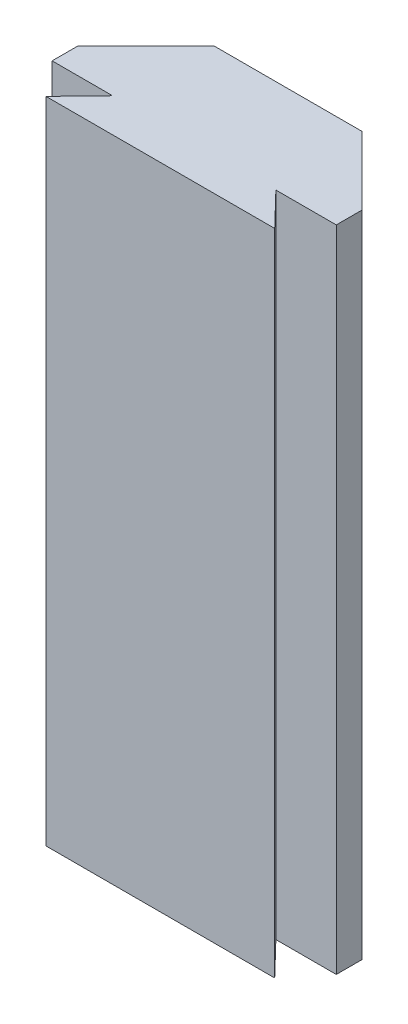
ISO-10303-21;
HEADER;
FILE_DESCRIPTION(('STEP AP214'),'2;1');
FILE_NAME('part.step','',(''),(''),'','','');
FILE_SCHEMA(('AUTOMOTIVE_DESIGN { 1 0 10303 214 1 1 1 1 }'));
ENDSEC;
DATA;
#1=APPLICATION_CONTEXT('core data for automotive mechanical design processes');
#2=APPLICATION_PROTOCOL_DEFINITION('international standard','automotive_design',2000,#1);
#3=PRODUCT_CONTEXT('',#1,'mechanical');
#4=PRODUCT('Part','Part','',(#3));
#5=PRODUCT_RELATED_PRODUCT_CATEGORY('part','',(#4));
#6=PRODUCT_DEFINITION_FORMATION('','',#4);
#7=PRODUCT_DEFINITION_CONTEXT('part definition',#1,'design');
#8=PRODUCT_DEFINITION('design','',#6,#7);
#9=PRODUCT_DEFINITION_SHAPE('','',#8);
#10=(LENGTH_UNIT() NAMED_UNIT(*) SI_UNIT(.MILLI.,.METRE.));
#11=(NAMED_UNIT(*) PLANE_ANGLE_UNIT() SI_UNIT($,.RADIAN.));
#12=(NAMED_UNIT(*) SI_UNIT($,.STERADIAN.) SOLID_ANGLE_UNIT());
#13=UNCERTAINTY_MEASURE_WITH_UNIT(LENGTH_MEASURE(1.E-05),#10,'distance_accuracy_value','');
#14=(GEOMETRIC_REPRESENTATION_CONTEXT(3) GLOBAL_UNCERTAINTY_ASSIGNED_CONTEXT((#13)) GLOBAL_UNIT_ASSIGNED_CONTEXT((#10,
#11,#12)) REPRESENTATION_CONTEXT('',''));
#15=CARTESIAN_POINT('',(0.,0.,0.));
#16=DIRECTION('',(0.,0.,1.));
#17=DIRECTION('',(1.,0.,0.));
#18=AXIS2_PLACEMENT_3D('',#15,#16,#17);
#19=CARTESIAN_POINT('',(-2.62929539890908,25.25,0.366574883446381));
#20=DIRECTION('',(0.707106781186544,0.,0.707106781186551));
#21=DIRECTION('',(0.707106781186551,0.,-0.707106781186544));
#22=AXIS2_PLACEMENT_3D('',#19,#20,#21);
#23=PLANE('',#22);
#24=DIRECTION('',(-0.707106781186551,0.,0.707106781186544));
#25=VECTOR('',#24,1.);
#26=CARTESIAN_POINT('',(-2.62929539890908,0.,0.366574883446381));
#27=LINE('',#26,#25);
#28=CARTESIAN_POINT('',(-2.62929539890908,0.,0.366574883446381));
#29=VERTEX_POINT('',#28);
#30=CARTESIAN_POINT('',(-5.28094582835865,0.,3.01822531289592));
#31=VERTEX_POINT('',#30);
#32=EDGE_CURVE('E141',#29,#31,#27,.T.);
#33=ORIENTED_EDGE('',*,*,#32,.T.);
#34=DIRECTION('',(0.,-1.,0.));
#35=VECTOR('',#34,1.);
#36=CARTESIAN_POINT('',(-5.28094582835865,25.25,3.01822531289592));
#37=LINE('',#36,#35);
#38=CARTESIAN_POINT('',(-5.28094582835865,25.25,3.01822531289592));
#39=VERTEX_POINT('',#38);
#40=EDGE_CURVE('E11',#39,#31,#37,.T.);
#41=ORIENTED_EDGE('',*,*,#40,.F.);
#42=DIRECTION('',(-0.707106781186551,0.,0.707106781186544));
#43=VECTOR('',#42,1.);
#44=CARTESIAN_POINT('',(-2.62929539890908,25.25,0.366574883446381));
#45=LINE('',#44,#43);
#46=CARTESIAN_POINT('',(-2.62929539890908,25.25,0.366574883446381));
#47=VERTEX_POINT('',#46);
#48=EDGE_CURVE('E159',#47,#39,#45,.T.);
#49=ORIENTED_EDGE('',*,*,#48,.F.);
#50=DIRECTION('',(0.,-1.,0.));
#51=VECTOR('',#50,1.);
#52=CARTESIAN_POINT('',(-2.62929539890908,25.25,0.366574883446381));
#53=LINE('',#52,#51);
#54=EDGE_CURVE('E137',#47,#29,#53,.T.);
#55=ORIENTED_EDGE('',*,*,#54,.T.);
#56=EDGE_LOOP('',(#33,#41,#49,#55));
#57=FACE_BOUND('',#56,.T.);
#58=ADVANCED_FACE('F33',(#57),#23,.F.);
#59=CARTESIAN_POINT('',(-5.28094582835865,25.25,3.01822531289592));
#60=DIRECTION('',(1.,0.,0.));
#61=DIRECTION('',(0.,0.,-1.));
#62=AXIS2_PLACEMENT_3D('',#59,#60,#61);
#63=PLANE('',#62);
#64=DIRECTION('',(0.,0.,1.));
#65=VECTOR('',#64,1.);
#66=CARTESIAN_POINT('',(-5.28094582835865,0.,3.01822531289592));
#67=LINE('',#66,#65);
#68=CARTESIAN_POINT('',(-5.28094582835865,0.,4.01822531289592));
#69=VERTEX_POINT('',#68);
#70=EDGE_CURVE('E144',#31,#69,#67,.T.);
#71=ORIENTED_EDGE('',*,*,#70,.T.);
#72=DIRECTION('',(0.,-1.,0.));
#73=VECTOR('',#72,1.);
#74=CARTESIAN_POINT('',(-5.28094582835865,25.25,4.01822531289592));
#75=LINE('',#74,#73);
#76=CARTESIAN_POINT('',(-5.28094582835865,25.25,4.01822531289592));
#77=VERTEX_POINT('',#76);
#78=EDGE_CURVE('E41',#77,#69,#75,.T.);
#79=ORIENTED_EDGE('',*,*,#78,.F.);
#80=DIRECTION('',(0.,0.,1.));
#81=VECTOR('',#80,1.);
#82=CARTESIAN_POINT('',(-5.28094582835865,25.25,3.01822531289592));
#83=LINE('',#82,#81);
#84=EDGE_CURVE('E98',#39,#77,#83,.T.);
#85=ORIENTED_EDGE('',*,*,#84,.F.);
#86=ORIENTED_EDGE('',*,*,#40,.T.);
#87=EDGE_LOOP('',(#71,#79,#85,#86));
#88=FACE_BOUND('',#87,.T.);
#89=ADVANCED_FACE('F208',(#88),#63,.F.);
#90=CARTESIAN_POINT('',(-5.28094582835865,25.25,4.01822531289592));
#91=DIRECTION('',(0.,0.,-1.));
#92=DIRECTION('',(-1.,0.,0.));
#93=AXIS2_PLACEMENT_3D('',#90,#91,#92);
#94=PLANE('',#93);
#95=DIRECTION('',(1.,0.,0.));
#96=VECTOR('',#95,1.);
#97=CARTESIAN_POINT('',(-5.28094582835865,0.,4.01822531289592));
#98=LINE('',#97,#96);
#99=CARTESIAN_POINT('',(-2.93094582835865,0.,4.01822531289592));
#100=VERTEX_POINT('',#99);
#101=EDGE_CURVE('E146',#69,#100,#98,.T.);
#102=ORIENTED_EDGE('',*,*,#101,.T.);
#103=DIRECTION('',(0.,-1.,0.));
#104=VECTOR('',#103,1.);
#105=CARTESIAN_POINT('',(-2.93094582835865,25.25,4.01822531289592));
#106=LINE('',#105,#104);
#107=CARTESIAN_POINT('',(-2.93094582835865,25.25,4.01822531289592));
#108=VERTEX_POINT('',#107);
#109=EDGE_CURVE('E172',#108,#100,#106,.T.);
#110=ORIENTED_EDGE('',*,*,#109,.F.);
#111=DIRECTION('',(1.,0.,0.));
#112=VECTOR('',#111,1.);
#113=CARTESIAN_POINT('',(-5.28094582835865,25.25,4.01822531289592));
#114=LINE('',#113,#112);
#115=EDGE_CURVE('E180',#77,#108,#114,.T.);
#116=ORIENTED_EDGE('',*,*,#115,.F.);
#117=ORIENTED_EDGE('',*,*,#78,.T.);
#118=EDGE_LOOP('',(#102,#110,#116,#117));
#119=FACE_BOUND('',#118,.T.);
#120=ADVANCED_FACE('F178',(#119),#94,.F.);
#121=CARTESIAN_POINT('',(-2.93094582835865,25.25,4.01822531289592));
#122=DIRECTION('',(0.719339800338646,0.,0.694658370459002));
#123=DIRECTION('',(0.694658370459002,0.,-0.719339800338646));
#124=AXIS2_PLACEMENT_3D('',#121,#122,#123);
#125=PLANE('',#124);
#126=DIRECTION('',(-0.694658370459002,0.,0.719339800338646));
#127=VECTOR('',#126,1.);
#128=CARTESIAN_POINT('',(-2.93094582835865,0.,4.01822531289592));
#129=LINE('',#128,#127);
#130=CARTESIAN_POINT('',(-4.20217064629862,0.,5.33461714751564));
#131=VERTEX_POINT('',#130);
#132=EDGE_CURVE('E148',#100,#131,#129,.T.);
#133=ORIENTED_EDGE('',*,*,#132,.T.);
#134=DIRECTION('',(0.,-1.,0.));
#135=VECTOR('',#134,1.);
#136=CARTESIAN_POINT('',(-4.20217064629862,25.25,5.33461714751564));
#137=LINE('',#136,#135);
#138=CARTESIAN_POINT('',(-4.20217064629862,25.25,5.33461714751564));
#139=VERTEX_POINT('',#138);
#140=EDGE_CURVE('E169',#139,#131,#137,.T.);
#141=ORIENTED_EDGE('',*,*,#140,.F.);
#142=DIRECTION('',(-0.694658370459002,0.,0.719339800338646));
#143=VECTOR('',#142,1.);
#144=CARTESIAN_POINT('',(-2.93094582835865,25.25,4.01822531289592));
#145=LINE('',#144,#143);
#146=EDGE_CURVE('E198',#108,#139,#145,.T.);
#147=ORIENTED_EDGE('',*,*,#146,.F.);
#148=ORIENTED_EDGE('',*,*,#109,.T.);
#149=EDGE_LOOP('',(#133,#141,#147,#148));
#150=FACE_BOUND('',#149,.T.);
#151=ADVANCED_FACE('F189',(#150),#125,.F.);
#152=CARTESIAN_POINT('',(-4.20217064629862,25.25,5.33461714751564));
#153=DIRECTION('',(0.,0.,-1.));
#154=DIRECTION('',(-1.,0.,0.));
#155=AXIS2_PLACEMENT_3D('',#152,#153,#154);
#156=PLANE('',#155);
#157=DIRECTION('',(1.,0.,0.));
#158=VECTOR('',#157,1.);
#159=CARTESIAN_POINT('',(-4.20217064629862,0.,5.33461714751564));
#160=LINE('',#159,#158);
#161=CARTESIAN_POINT('',(4.69357984848043,0.,5.33461714751566));
#162=VERTEX_POINT('',#161);
#163=EDGE_CURVE('E150',#131,#162,#160,.T.);
#164=ORIENTED_EDGE('',*,*,#163,.T.);
#165=DIRECTION('',(0.,-1.,0.));
#166=VECTOR('',#165,1.);
#167=CARTESIAN_POINT('',(4.69357984848043,25.25,5.33461714751566));
#168=LINE('',#167,#166);
#169=CARTESIAN_POINT('',(4.69357984848043,25.25,5.33461714751566));
#170=VERTEX_POINT('',#169);
#171=EDGE_CURVE('E166',#170,#162,#168,.T.);
#172=ORIENTED_EDGE('',*,*,#171,.F.);
#173=DIRECTION('',(1.,0.,0.));
#174=VECTOR('',#173,1.);
#175=CARTESIAN_POINT('',(-4.20217064629862,25.25,5.33461714751564));
#176=LINE('',#175,#174);
#177=EDGE_CURVE('E195',#139,#170,#176,.T.);
#178=ORIENTED_EDGE('',*,*,#177,.F.);
#179=ORIENTED_EDGE('',*,*,#140,.T.);
#180=EDGE_LOOP('',(#164,#172,#178,#179));
#181=FACE_BOUND('',#180,.T.);
#182=ADVANCED_FACE('F193',(#181),#156,.F.);
#183=CARTESIAN_POINT('',(3.42235503054046,25.25,4.01822531289594));
#184=DIRECTION('',(-0.719339800338647,0.,0.694658370459002));
#185=DIRECTION('',(0.694658370459002,0.,0.719339800338647));
#186=AXIS2_PLACEMENT_3D('',#183,#184,#185);
#187=PLANE('',#186);
#188=DIRECTION('',(-0.694658370459002,0.,-0.719339800338647));
#189=VECTOR('',#188,1.);
#190=CARTESIAN_POINT('',(3.42235503054046,0.,4.01822531289594));
#191=LINE('',#190,#189);
#192=CARTESIAN_POINT('',(3.42235503054046,0.,4.01822531289594));
#193=VERTEX_POINT('',#192);
#194=EDGE_CURVE('E152',#162,#193,#191,.T.);
#195=ORIENTED_EDGE('',*,*,#194,.T.);
#196=DIRECTION('',(0.,-1.,0.));
#197=VECTOR('',#196,1.);
#198=CARTESIAN_POINT('',(3.42235503054046,25.25,4.01822531289594));
#199=LINE('',#198,#197);
#200=CARTESIAN_POINT('',(3.42235503054046,25.25,4.01822531289594));
#201=VERTEX_POINT('',#200);
#202=EDGE_CURVE('E163',#201,#193,#199,.T.);
#203=ORIENTED_EDGE('',*,*,#202,.F.);
#204=DIRECTION('',(-0.694658370459002,0.,-0.719339800338647));
#205=VECTOR('',#204,1.);
#206=CARTESIAN_POINT('',(3.42235503054046,25.25,4.01822531289594));
#207=LINE('',#206,#205);
#208=EDGE_CURVE('E197',#170,#201,#207,.T.);
#209=ORIENTED_EDGE('',*,*,#208,.F.);
#210=ORIENTED_EDGE('',*,*,#171,.T.);
#211=EDGE_LOOP('',(#195,#203,#209,#210));
#212=FACE_BOUND('',#211,.T.);
#213=ADVANCED_FACE('F220',(#212),#187,.F.);
#214=CARTESIAN_POINT('',(5.77235503054046,25.25,4.01822531289594));
#215=DIRECTION('',(0.,0.,-1.));
#216=DIRECTION('',(-1.,0.,0.));
#217=AXIS2_PLACEMENT_3D('',#214,#215,#216);
#218=PLANE('',#217);
#219=DIRECTION('',(1.,0.,0.));
#220=VECTOR('',#219,1.);
#221=CARTESIAN_POINT('',(5.77235503054046,0.,4.01822531289594));
#222=LINE('',#221,#220);
#223=CARTESIAN_POINT('',(5.77235503054046,0.,4.01822531289594));
#224=VERTEX_POINT('',#223);
#225=EDGE_CURVE('E154',#193,#224,#222,.T.);
#226=ORIENTED_EDGE('',*,*,#225,.T.);
#227=DIRECTION('',(0.,-1.,0.));
#228=VECTOR('',#227,1.);
#229=CARTESIAN_POINT('',(5.77235503054046,25.25,4.01822531289594));
#230=LINE('',#229,#228);
#231=CARTESIAN_POINT('',(5.77235503054046,25.25,4.01822531289594));
#232=VERTEX_POINT('',#231);
#233=EDGE_CURVE('E132',#232,#224,#230,.T.);
#234=ORIENTED_EDGE('',*,*,#233,.F.);
#235=DIRECTION('',(1.,0.,0.));
#236=VECTOR('',#235,1.);
#237=CARTESIAN_POINT('',(5.77235503054046,25.25,4.01822531289594));
#238=LINE('',#237,#236);
#239=EDGE_CURVE('E123',#201,#232,#238,.T.);
#240=ORIENTED_EDGE('',*,*,#239,.F.);
#241=ORIENTED_EDGE('',*,*,#202,.T.);
#242=EDGE_LOOP('',(#226,#234,#240,#241));
#243=FACE_BOUND('',#242,.T.);
#244=ADVANCED_FACE('F223',(#243),#218,.F.);
#245=CARTESIAN_POINT('',(5.77235503054046,25.25,3.01822531289594));
#246=DIRECTION('',(-1.,0.,0.));
#247=DIRECTION('',(0.,0.,1.));
#248=AXIS2_PLACEMENT_3D('',#245,#246,#247);
#249=PLANE('',#248);
#250=DIRECTION('',(0.,0.,-1.));
#251=VECTOR('',#250,1.);
#252=CARTESIAN_POINT('',(5.77235503054046,0.,3.01822531289594));
#253=LINE('',#252,#251);
#254=CARTESIAN_POINT('',(5.77235503054046,0.,3.01822531289594));
#255=VERTEX_POINT('',#254);
#256=EDGE_CURVE('E131',#224,#255,#253,.T.);
#257=ORIENTED_EDGE('',*,*,#256,.T.);
#258=DIRECTION('',(0.,-1.,0.));
#259=VECTOR('',#258,1.);
#260=CARTESIAN_POINT('',(5.77235503054046,25.25,3.01822531289594));
#261=LINE('',#260,#259);
#262=CARTESIAN_POINT('',(5.77235503054046,25.25,3.01822531289594));
#263=VERTEX_POINT('',#262);
#264=EDGE_CURVE('E128',#263,#255,#261,.T.);
#265=ORIENTED_EDGE('',*,*,#264,.F.);
#266=DIRECTION('',(0.,0.,-1.));
#267=VECTOR('',#266,1.);
#268=CARTESIAN_POINT('',(5.77235503054046,25.25,3.01822531289594));
#269=LINE('',#268,#267);
#270=EDGE_CURVE('E117',#232,#263,#269,.T.);
#271=ORIENTED_EDGE('',*,*,#270,.F.);
#272=ORIENTED_EDGE('',*,*,#233,.T.);
#273=EDGE_LOOP('',(#257,#265,#271,#272));
#274=FACE_BOUND('',#273,.T.);
#275=ADVANCED_FACE('F129',(#274),#249,.F.);
#276=CARTESIAN_POINT('',(3.12070460109092,25.25,0.366574883446379));
#277=DIRECTION('',(-0.70710678118655,0.,0.707106781186546));
#278=DIRECTION('',(0.707106781186546,0.,0.70710678118655));
#279=AXIS2_PLACEMENT_3D('',#276,#277,#278);
#280=PLANE('',#279);
#281=DIRECTION('',(-0.707106781186545,0.,-0.70710678118655));
#282=VECTOR('',#281,1.);
#283=CARTESIAN_POINT('',(3.12070460109092,0.,0.366574883446379));
#284=LINE('',#283,#282);
#285=CARTESIAN_POINT('',(3.12070460109092,0.,0.366574883446379));
#286=VERTEX_POINT('',#285);
#287=EDGE_CURVE('E84',#255,#286,#284,.T.);
#288=ORIENTED_EDGE('',*,*,#287,.T.);
#289=DIRECTION('',(0.,-1.,0.));
#290=VECTOR('',#289,1.);
#291=CARTESIAN_POINT('',(3.12070460109092,25.25,0.366574883446379));
#292=LINE('',#291,#290);
#293=CARTESIAN_POINT('',(3.12070460109092,25.25,0.366574883446379));
#294=VERTEX_POINT('',#293);
#295=EDGE_CURVE('E133',#294,#286,#292,.T.);
#296=ORIENTED_EDGE('',*,*,#295,.F.);
#297=DIRECTION('',(-0.707106781186545,0.,-0.70710678118655));
#298=VECTOR('',#297,1.);
#299=CARTESIAN_POINT('',(3.12070460109092,25.25,0.366574883446379));
#300=LINE('',#299,#298);
#301=EDGE_CURVE('E121',#263,#294,#300,.T.);
#302=ORIENTED_EDGE('',*,*,#301,.F.);
#303=ORIENTED_EDGE('',*,*,#264,.T.);
#304=EDGE_LOOP('',(#288,#296,#302,#303));
#305=FACE_BOUND('',#304,.T.);
#306=ADVANCED_FACE('F135',(#305),#280,.F.);
#307=CARTESIAN_POINT('',(-2.62929539890908,25.25,0.366574883446381));
#308=DIRECTION('',(0.,0.,1.));
#309=DIRECTION('',(1.,0.,0.));
#310=AXIS2_PLACEMENT_3D('',#307,#308,#309);
#311=PLANE('',#310);
#312=DIRECTION('',(-1.,0.,0.));
#313=VECTOR('',#312,1.);
#314=CARTESIAN_POINT('',(-2.62929539890908,0.,0.366574883446381));
#315=LINE('',#314,#313);
#316=EDGE_CURVE('E90',#286,#29,#315,.T.);
#317=ORIENTED_EDGE('',*,*,#316,.T.);
#318=ORIENTED_EDGE('',*,*,#54,.F.);
#319=DIRECTION('',(-1.,0.,0.));
#320=VECTOR('',#319,1.);
#321=CARTESIAN_POINT('',(-2.62929539890908,25.25,0.366574883446381));
#322=LINE('',#321,#320);
#323=EDGE_CURVE('E49',#294,#47,#322,.T.);
#324=ORIENTED_EDGE('',*,*,#323,.F.);
#325=ORIENTED_EDGE('',*,*,#295,.T.);
#326=EDGE_LOOP('',(#317,#318,#324,#325));
#327=FACE_BOUND('',#326,.T.);
#328=ADVANCED_FACE('F232',(#327),#311,.F.);
#329=CARTESIAN_POINT('',(0.,25.25,0.));
#330=DIRECTION('',(0.,1.,0.));
#331=DIRECTION('',(0.,0.,1.));
#332=AXIS2_PLACEMENT_3D('',#329,#330,#331);
#333=PLANE('',#332);
#334=ORIENTED_EDGE('',*,*,#48,.T.);
#335=ORIENTED_EDGE('',*,*,#84,.T.);
#336=ORIENTED_EDGE('',*,*,#115,.T.);
#337=ORIENTED_EDGE('',*,*,#146,.T.);
#338=ORIENTED_EDGE('',*,*,#177,.T.);
#339=ORIENTED_EDGE('',*,*,#208,.T.);
#340=ORIENTED_EDGE('',*,*,#239,.T.);
#341=ORIENTED_EDGE('',*,*,#270,.T.);
#342=ORIENTED_EDGE('',*,*,#301,.T.);
#343=ORIENTED_EDGE('',*,*,#323,.T.);
#344=EDGE_LOOP('',(#334,#335,#336,#337,#338,#339,#340,#341,#342,#343));
#345=FACE_BOUND('',#344,.T.);
#346=ADVANCED_FACE('F119',(#345),#333,.T.);
#347=CARTESIAN_POINT('',(0.,0.,0.));
#348=DIRECTION('',(0.,1.,0.));
#349=DIRECTION('',(0.,0.,1.));
#350=AXIS2_PLACEMENT_3D('',#347,#348,#349);
#351=PLANE('',#350);
#352=ORIENTED_EDGE('',*,*,#32,.F.);
#353=ORIENTED_EDGE('',*,*,#316,.F.);
#354=ORIENTED_EDGE('',*,*,#287,.F.);
#355=ORIENTED_EDGE('',*,*,#256,.F.);
#356=ORIENTED_EDGE('',*,*,#225,.F.);
#357=ORIENTED_EDGE('',*,*,#194,.F.);
#358=ORIENTED_EDGE('',*,*,#163,.F.);
#359=ORIENTED_EDGE('',*,*,#132,.F.);
#360=ORIENTED_EDGE('',*,*,#101,.F.);
#361=ORIENTED_EDGE('',*,*,#70,.F.);
#362=EDGE_LOOP('',(#352,#353,#354,#355,#356,#357,#358,#359,#360,#361));
#363=FACE_BOUND('',#362,.T.);
#364=ADVANCED_FACE('F184',(#363),#351,.F.);
#365=CLOSED_SHELL('',(#58,#89,#120,#151,#182,#213,#244,#275,#306,#328,#346,#364));
#366=MANIFOLD_SOLID_BREP('B2',#365);
#367=ADVANCED_BREP_SHAPE_REPRESENTATION('',(#18,#366),#14);
#368=SHAPE_DEFINITION_REPRESENTATION(#9,#367);
ENDSEC;
END-ISO-10303-21;
